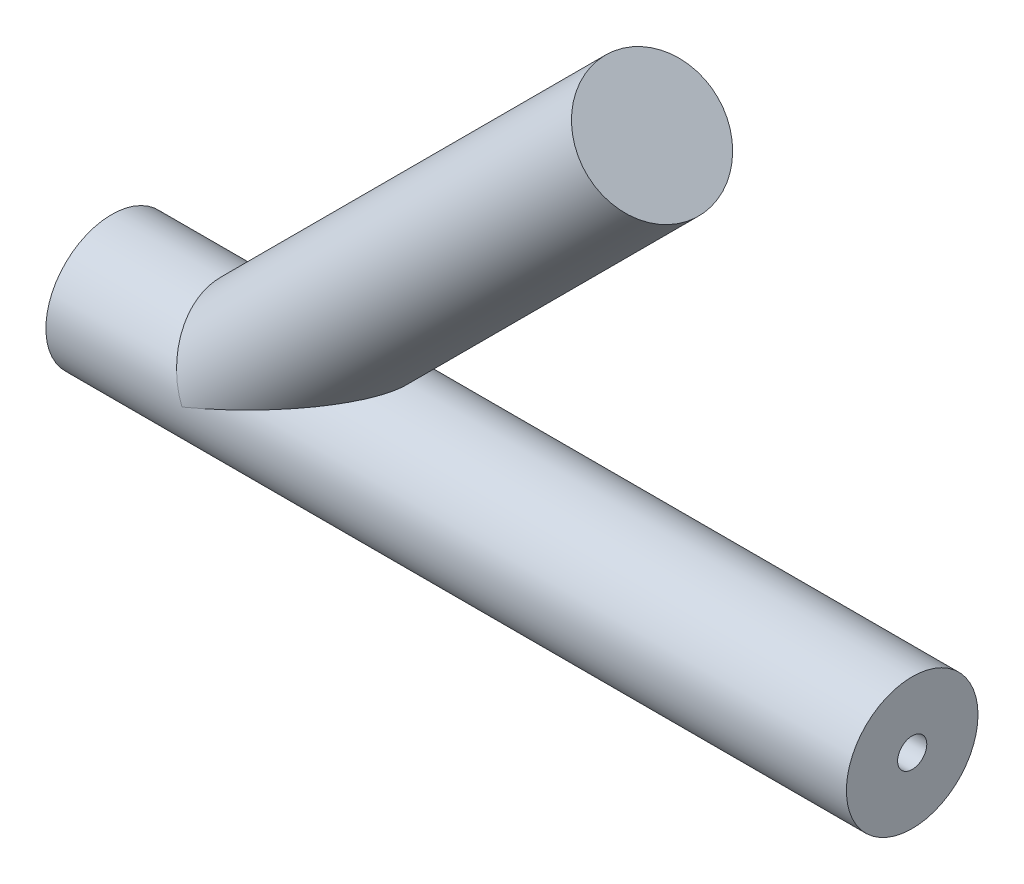
ISO-10303-21;
HEADER;
FILE_DESCRIPTION(('STEP AP214'),'2;1');
FILE_NAME('part.step','',(''),(''),'','','');
FILE_SCHEMA(('AUTOMOTIVE_DESIGN { 1 0 10303 214 1 1 1 1 }'));
ENDSEC;
DATA;
#1=APPLICATION_CONTEXT('core data for automotive mechanical design processes');
#2=APPLICATION_PROTOCOL_DEFINITION('international standard','automotive_design',2000,#1);
#3=PRODUCT_CONTEXT('',#1,'mechanical');
#4=PRODUCT('Part','Part','',(#3));
#5=PRODUCT_RELATED_PRODUCT_CATEGORY('part','',(#4));
#6=PRODUCT_DEFINITION_FORMATION('','',#4);
#7=PRODUCT_DEFINITION_CONTEXT('part definition',#1,'design');
#8=PRODUCT_DEFINITION('design','',#6,#7);
#9=PRODUCT_DEFINITION_SHAPE('','',#8);
#10=(LENGTH_UNIT() NAMED_UNIT(*) SI_UNIT(.MILLI.,.METRE.));
#11=(NAMED_UNIT(*) PLANE_ANGLE_UNIT() SI_UNIT($,.RADIAN.));
#12=(NAMED_UNIT(*) SI_UNIT($,.STERADIAN.) SOLID_ANGLE_UNIT());
#13=UNCERTAINTY_MEASURE_WITH_UNIT(LENGTH_MEASURE(1.E-05),#10,'distance_accuracy_value','');
#14=(GEOMETRIC_REPRESENTATION_CONTEXT(3) GLOBAL_UNCERTAINTY_ASSIGNED_CONTEXT((#13)) GLOBAL_UNIT_ASSIGNED_CONTEXT((#10,
#11,#12)) REPRESENTATION_CONTEXT('',''));
#15=CARTESIAN_POINT('',(0.,0.,0.));
#16=DIRECTION('',(0.,0.,1.));
#17=DIRECTION('',(1.,0.,0.));
#18=AXIS2_PLACEMENT_3D('',#15,#16,#17);
#19=CARTESIAN_POINT('',(271.932743754835,15.5367720528237,-0.00017220734576104));
#20=DIRECTION('',(-1.,0.,0.));
#21=DIRECTION('',(0.,0.,1.));
#22=AXIS2_PLACEMENT_3D('',#19,#20,#21);
#23=CYLINDRICAL_SURFACE('',#22,16.9164);
#24=CARTESIAN_POINT('',(66.1327437548353,15.5367720528237,-0.00017220734576104));
#25=DIRECTION('',(1.,0.,0.));
#26=DIRECTION('',(0.,0.,-1.));
#27=AXIS2_PLACEMENT_3D('',#24,#25,#26);
#28=CIRCLE('',#27,16.9164);
#29=CARTESIAN_POINT('',(66.1327437548353,15.5367720528237,-16.9165722073458));
#30=VERTEX_POINT('',#29);
#31=EDGE_CURVE('E56',#30,#30,#28,.T.);
#32=ORIENTED_EDGE('',*,*,#31,.T.);
#33=EDGE_LOOP('',(#32));
#34=FACE_BOUND('',#33,.T.);
#35=CARTESIAN_POINT('',(271.932743754835,15.5367720528237,-0.00017220734576104));
#36=DIRECTION('',(1.,0.,0.));
#37=DIRECTION('',(0.,0.,-1.));
#38=AXIS2_PLACEMENT_3D('',#35,#36,#37);
#39=CIRCLE('',#38,16.9164);
#40=CARTESIAN_POINT('',(271.932743754835,15.5367720528237,-16.9165722073458));
#41=VERTEX_POINT('',#40);
#42=EDGE_CURVE('E54',#41,#41,#39,.T.);
#43=ORIENTED_EDGE('',*,*,#42,.F.);
#44=EDGE_LOOP('',(#43));
#45=FACE_BOUND('',#44,.T.);
#46=CARTESIAN_POINT('',(101.112743754835,15.5367720528237,-0.00017220734576104));
#47=DIRECTION('',(-0.923879532511287,-0.382683432365089,0.));
#48=DIRECTION('',(-0.382683432365089,0.923879532511287,0.));
#49=AXIS2_PLACEMENT_3D('',#46,#47,#48);
#50=ELLIPSE('',#49,18.3101794170262,16.9164);
#51=CARTESIAN_POINT('',(101.112743754835,15.5367720528237,-16.9165722073458));
#52=VERTEX_POINT('',#51);
#53=CARTESIAN_POINT('',(101.112743754835,15.5367720528237,16.9162277926542));
#54=VERTEX_POINT('',#53);
#55=EDGE_CURVE('E11',#52,#54,#50,.F.);
#56=ORIENTED_EDGE('',*,*,#55,.F.);
#57=CARTESIAN_POINT('',(101.112743754835,15.5367720528237,-0.00017220734576104));
#58=DIRECTION('',(-0.382683432365089,0.923879532511287,0.));
#59=DIRECTION('',(-0.923879532511287,-0.382683432365089,0.));
#60=AXIS2_PLACEMENT_3D('',#57,#58,#59);
#61=ELLIPSE('',#60,44.2046834780695,16.9164);
#62=EDGE_CURVE('E46',#54,#52,#61,.T.);
#63=ORIENTED_EDGE('',*,*,#62,.F.);
#64=EDGE_LOOP('',(#56,#63));
#65=FACE_BOUND('',#64,.T.);
#66=ADVANCED_FACE('F39',(#34,#45,#65),#23,.T.);
#67=CARTESIAN_POINT('',(271.932743754835,15.5367720528237,-0.00017220734576104));
#68=DIRECTION('',(1.,0.,0.));
#69=DIRECTION('',(0.,0.,-1.));
#70=AXIS2_PLACEMENT_3D('',#67,#68,#69);
#71=PLANE('',#70);
#72=CARTESIAN_POINT('',(271.932743754835,15.5367720528237,-0.00017220734576104));
#73=DIRECTION('',(1.,0.,0.));
#74=DIRECTION('',(0.,0.,-1.));
#75=AXIS2_PLACEMENT_3D('',#72,#73,#74);
#76=CIRCLE('',#75,3.75);
#77=CARTESIAN_POINT('',(271.932743754835,15.5367720528237,-3.75017220734576));
#78=VERTEX_POINT('',#77);
#79=EDGE_CURVE('E64',#78,#78,#76,.T.);
#80=ORIENTED_EDGE('',*,*,#79,.F.);
#81=EDGE_LOOP('',(#80));
#82=FACE_BOUND('',#81,.T.);
#83=ORIENTED_EDGE('',*,*,#42,.T.);
#84=EDGE_LOOP('',(#83));
#85=FACE_BOUND('',#84,.T.);
#86=ADVANCED_FACE('F76',(#82,#85),#71,.T.);
#87=CARTESIAN_POINT('',(66.1327437548353,15.5367720528237,-0.00017220734576104));
#88=DIRECTION('',(1.,0.,0.));
#89=DIRECTION('',(0.,0.,-1.));
#90=AXIS2_PLACEMENT_3D('',#87,#88,#89);
#91=PLANE('',#90);
#92=CARTESIAN_POINT('',(66.1327437548353,15.5367720528237,-0.00017220734576104));
#93=DIRECTION('',(-1.,0.,0.));
#94=DIRECTION('',(0.,0.,1.));
#95=AXIS2_PLACEMENT_3D('',#92,#93,#94);
#96=CIRCLE('',#95,3.75);
#97=CARTESIAN_POINT('',(66.1327437548353,15.5367720528237,3.74982779265424));
#98=VERTEX_POINT('',#97);
#99=EDGE_CURVE('E67',#98,#98,#96,.T.);
#100=ORIENTED_EDGE('',*,*,#99,.F.);
#101=EDGE_LOOP('',(#100));
#102=FACE_BOUND('',#101,.T.);
#103=ORIENTED_EDGE('',*,*,#31,.F.);
#104=EDGE_LOOP('',(#103));
#105=FACE_BOUND('',#104,.T.);
#106=ADVANCED_FACE('F73',(#102,#105),#91,.F.);
#107=CARTESIAN_POINT('',(205.057440589258,119.481468887246,-0.00017220734576104));
#108=DIRECTION('',(-0.707106781186549,-0.707106781186546,0.));
#109=DIRECTION('',(0.707106781186546,-0.707106781186549,0.));
#110=AXIS2_PLACEMENT_3D('',#107,#108,#109);
#111=CYLINDRICAL_SURFACE('',#110,16.9164);
#112=CARTESIAN_POINT('',(205.057440589258,119.481468887246,-0.00017220734576104));
#113=DIRECTION('',(0.707106781186549,0.707106781186546,0.));
#114=DIRECTION('',(-0.707106781186546,0.707106781186549,0.));
#115=AXIS2_PLACEMENT_3D('',#112,#113,#114);
#116=CIRCLE('',#115,16.9164);
#117=CARTESIAN_POINT('',(193.095739435994,131.44317004051,-0.00017220734576104));
#118=VERTEX_POINT('',#117);
#119=EDGE_CURVE('E60',#118,#118,#116,.T.);
#120=ORIENTED_EDGE('',*,*,#119,.F.);
#121=EDGE_LOOP('',(#120));
#122=FACE_BOUND('',#121,.T.);
#123=ORIENTED_EDGE('',*,*,#62,.T.);
#124=ORIENTED_EDGE('',*,*,#55,.T.);
#125=EDGE_LOOP('',(#123,#124));
#126=FACE_BOUND('',#125,.T.);
#127=ADVANCED_FACE('F53',(#122,#126),#111,.T.);
#128=CARTESIAN_POINT('',(205.057440589258,119.481468887246,-0.00017220734576104));
#129=DIRECTION('',(0.707106781186549,0.707106781186546,0.));
#130=DIRECTION('',(-0.707106781186546,0.707106781186549,0.));
#131=AXIS2_PLACEMENT_3D('',#128,#129,#130);
#132=PLANE('',#131);
#133=ORIENTED_EDGE('',*,*,#119,.T.);
#134=EDGE_LOOP('',(#133));
#135=FACE_BOUND('',#134,.T.);
#136=ADVANCED_FACE('F92',(#135),#132,.T.);
#137=CARTESIAN_POINT('',(287.772743754835,15.5367720528237,-0.00017220734576104));
#138=DIRECTION('',(-1.,0.,0.));
#139=DIRECTION('',(0.,0.,1.));
#140=AXIS2_PLACEMENT_3D('',#137,#138,#139);
#141=CYLINDRICAL_SURFACE('',#140,3.75);
#142=ORIENTED_EDGE('',*,*,#79,.T.);
#143=EDGE_LOOP('',(#142));
#144=FACE_BOUND('',#143,.T.);
#145=ORIENTED_EDGE('',*,*,#99,.T.);
#146=EDGE_LOOP('',(#145));
#147=FACE_BOUND('',#146,.T.);
#148=ADVANCED_FACE('F71',(#144,#147),#141,.F.);
#149=CLOSED_SHELL('',(#66,#86,#106,#127,#136,#148));
#150=MANIFOLD_SOLID_BREP('B2',#149);
#151=ADVANCED_BREP_SHAPE_REPRESENTATION('',(#18,#150),#14);
#152=SHAPE_DEFINITION_REPRESENTATION(#9,#151);
ENDSEC;
END-ISO-10303-21;
